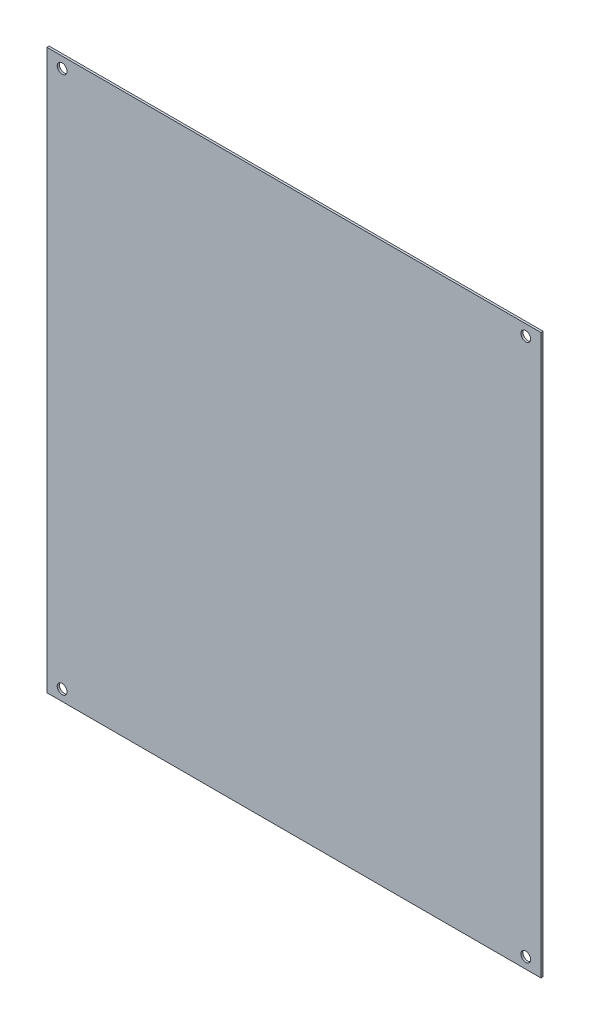
ISO-10303-21;
HEADER;
FILE_DESCRIPTION(('STEP AP214'),'2;1');
FILE_NAME('part.step','',(''),(''),'','','');
FILE_SCHEMA(('AUTOMOTIVE_DESIGN { 1 0 10303 214 1 1 1 1 }'));
ENDSEC;
DATA;
#1=APPLICATION_CONTEXT('core data for automotive mechanical design processes');
#2=APPLICATION_PROTOCOL_DEFINITION('international standard','automotive_design',2000,#1);
#3=PRODUCT_CONTEXT('',#1,'mechanical');
#4=PRODUCT('Part','Part','',(#3));
#5=PRODUCT_RELATED_PRODUCT_CATEGORY('part','',(#4));
#6=PRODUCT_DEFINITION_FORMATION('','',#4);
#7=PRODUCT_DEFINITION_CONTEXT('part definition',#1,'design');
#8=PRODUCT_DEFINITION('design','',#6,#7);
#9=PRODUCT_DEFINITION_SHAPE('','',#8);
#10=(LENGTH_UNIT() NAMED_UNIT(*) SI_UNIT(.MILLI.,.METRE.));
#11=(NAMED_UNIT(*) PLANE_ANGLE_UNIT() SI_UNIT($,.RADIAN.));
#12=(NAMED_UNIT(*) SI_UNIT($,.STERADIAN.) SOLID_ANGLE_UNIT());
#13=UNCERTAINTY_MEASURE_WITH_UNIT(LENGTH_MEASURE(1.E-05),#10,'distance_accuracy_value','');
#14=(GEOMETRIC_REPRESENTATION_CONTEXT(3) GLOBAL_UNCERTAINTY_ASSIGNED_CONTEXT((#13)) GLOBAL_UNIT_ASSIGNED_CONTEXT((#10,
#11,#12)) REPRESENTATION_CONTEXT('',''));
#15=CARTESIAN_POINT('',(0.,0.,0.));
#16=DIRECTION('',(0.,0.,1.));
#17=DIRECTION('',(1.,0.,0.));
#18=AXIS2_PLACEMENT_3D('',#15,#16,#17);
#19=CARTESIAN_POINT('',(-114.,129.,1.));
#20=DIRECTION('',(0.,0.,-1.));
#21=DIRECTION('',(-1.,0.,0.));
#22=AXIS2_PLACEMENT_3D('',#19,#20,#21);
#23=PLANE('',#22);
#24=CARTESIAN_POINT('',(107.,-124.,1.));
#25=DIRECTION('',(0.,0.,1.));
#26=DIRECTION('',(-1.,0.,0.));
#27=AXIS2_PLACEMENT_3D('',#24,#25,#26);
#28=CIRCLE('',#27,2.25);
#29=CARTESIAN_POINT('',(104.75,-124.,1.));
#30=VERTEX_POINT('',#29);
#31=EDGE_CURVE('E119',#30,#30,#28,.T.);
#32=ORIENTED_EDGE('',*,*,#31,.F.);
#33=EDGE_LOOP('',(#32));
#34=FACE_BOUND('',#33,.T.);
#35=CARTESIAN_POINT('',(-107.,124.,1.));
#36=DIRECTION('',(0.,0.,1.));
#37=DIRECTION('',(1.,0.,0.));
#38=AXIS2_PLACEMENT_3D('',#35,#36,#37);
#39=CIRCLE('',#38,2.25);
#40=CARTESIAN_POINT('',(-104.75,124.,1.));
#41=VERTEX_POINT('',#40);
#42=EDGE_CURVE('E98',#41,#41,#39,.T.);
#43=ORIENTED_EDGE('',*,*,#42,.F.);
#44=EDGE_LOOP('',(#43));
#45=FACE_BOUND('',#44,.T.);
#46=DIRECTION('',(0.,-1.,0.));
#47=VECTOR('',#46,1.);
#48=CARTESIAN_POINT('',(-114.,-129.,1.));
#49=LINE('',#48,#47);
#50=CARTESIAN_POINT('',(-114.,129.,1.));
#51=VERTEX_POINT('',#50);
#52=CARTESIAN_POINT('',(-114.,-129.,1.));
#53=VERTEX_POINT('',#52);
#54=EDGE_CURVE('E83',#51,#53,#49,.T.);
#55=ORIENTED_EDGE('',*,*,#54,.T.);
#56=DIRECTION('',(1.,0.,0.));
#57=VECTOR('',#56,1.);
#58=CARTESIAN_POINT('',(-114.,-129.,1.));
#59=LINE('',#58,#57);
#60=CARTESIAN_POINT('',(114.,-129.,1.));
#61=VERTEX_POINT('',#60);
#62=EDGE_CURVE('E78',#53,#61,#59,.T.);
#63=ORIENTED_EDGE('',*,*,#62,.T.);
#64=DIRECTION('',(0.,1.,0.));
#65=VECTOR('',#64,1.);
#66=CARTESIAN_POINT('',(114.,-129.,1.));
#67=LINE('',#66,#65);
#68=CARTESIAN_POINT('',(114.,129.,1.));
#69=VERTEX_POINT('',#68);
#70=EDGE_CURVE('E81',#61,#69,#67,.T.);
#71=ORIENTED_EDGE('',*,*,#70,.T.);
#72=DIRECTION('',(-1.,0.,0.));
#73=VECTOR('',#72,1.);
#74=CARTESIAN_POINT('',(-114.,129.,1.));
#75=LINE('',#74,#73);
#76=EDGE_CURVE('E48',#69,#51,#75,.T.);
#77=ORIENTED_EDGE('',*,*,#76,.T.);
#78=EDGE_LOOP('',(#55,#63,#71,#77));
#79=FACE_BOUND('',#78,.T.);
#80=CARTESIAN_POINT('',(107.,124.,1.));
#81=DIRECTION('',(0.,0.,1.));
#82=DIRECTION('',(1.,0.,0.));
#83=AXIS2_PLACEMENT_3D('',#80,#81,#82);
#84=CIRCLE('',#83,2.25);
#85=CARTESIAN_POINT('',(109.25,124.,1.));
#86=VERTEX_POINT('',#85);
#87=EDGE_CURVE('E113',#86,#86,#84,.T.);
#88=ORIENTED_EDGE('',*,*,#87,.F.);
#89=EDGE_LOOP('',(#88));
#90=FACE_BOUND('',#89,.T.);
#91=CARTESIAN_POINT('',(-107.,-124.,1.));
#92=DIRECTION('',(0.,0.,1.));
#93=DIRECTION('',(-1.,0.,0.));
#94=AXIS2_PLACEMENT_3D('',#91,#92,#93);
#95=CIRCLE('',#94,2.25);
#96=CARTESIAN_POINT('',(-109.25,-124.,1.));
#97=VERTEX_POINT('',#96);
#98=EDGE_CURVE('E125',#97,#97,#95,.T.);
#99=ORIENTED_EDGE('',*,*,#98,.F.);
#100=EDGE_LOOP('',(#99));
#101=FACE_BOUND('',#100,.T.);
#102=ADVANCED_FACE('F31',(#34,#45,#79,#90,#101),#23,.F.);
#103=CARTESIAN_POINT('',(-114.,129.,0.));
#104=DIRECTION('',(0.,0.,-1.));
#105=DIRECTION('',(-1.,0.,0.));
#106=AXIS2_PLACEMENT_3D('',#103,#104,#105);
#107=PLANE('',#106);
#108=CARTESIAN_POINT('',(107.,-124.,0.));
#109=DIRECTION('',(0.,0.,1.));
#110=DIRECTION('',(-1.,0.,0.));
#111=AXIS2_PLACEMENT_3D('',#108,#109,#110);
#112=CIRCLE('',#111,2.25);
#113=CARTESIAN_POINT('',(104.75,-124.,0.));
#114=VERTEX_POINT('',#113);
#115=EDGE_CURVE('E122',#114,#114,#112,.T.);
#116=ORIENTED_EDGE('',*,*,#115,.T.);
#117=EDGE_LOOP('',(#116));
#118=FACE_BOUND('',#117,.T.);
#119=CARTESIAN_POINT('',(-107.,124.,0.));
#120=DIRECTION('',(0.,0.,1.));
#121=DIRECTION('',(1.,0.,0.));
#122=AXIS2_PLACEMENT_3D('',#119,#120,#121);
#123=CIRCLE('',#122,2.25);
#124=CARTESIAN_POINT('',(-104.75,124.,0.));
#125=VERTEX_POINT('',#124);
#126=EDGE_CURVE('E110',#125,#125,#123,.T.);
#127=ORIENTED_EDGE('',*,*,#126,.T.);
#128=EDGE_LOOP('',(#127));
#129=FACE_BOUND('',#128,.T.);
#130=DIRECTION('',(0.,-1.,0.));
#131=VECTOR('',#130,1.);
#132=CARTESIAN_POINT('',(-114.,-129.,0.));
#133=LINE('',#132,#131);
#134=CARTESIAN_POINT('',(-114.,129.,0.));
#135=VERTEX_POINT('',#134);
#136=CARTESIAN_POINT('',(-114.,-129.,0.));
#137=VERTEX_POINT('',#136);
#138=EDGE_CURVE('E95',#135,#137,#133,.T.);
#139=ORIENTED_EDGE('',*,*,#138,.F.);
#140=DIRECTION('',(-1.,0.,0.));
#141=VECTOR('',#140,1.);
#142=CARTESIAN_POINT('',(-114.,129.,0.));
#143=LINE('',#142,#141);
#144=CARTESIAN_POINT('',(114.,129.,0.));
#145=VERTEX_POINT('',#144);
#146=EDGE_CURVE('E71',#145,#135,#143,.T.);
#147=ORIENTED_EDGE('',*,*,#146,.F.);
#148=DIRECTION('',(0.,1.,0.));
#149=VECTOR('',#148,1.);
#150=CARTESIAN_POINT('',(114.,-129.,0.));
#151=LINE('',#150,#149);
#152=CARTESIAN_POINT('',(114.,-129.,0.));
#153=VERTEX_POINT('',#152);
#154=EDGE_CURVE('E65',#153,#145,#151,.T.);
#155=ORIENTED_EDGE('',*,*,#154,.F.);
#156=DIRECTION('',(1.,0.,0.));
#157=VECTOR('',#156,1.);
#158=CARTESIAN_POINT('',(-114.,-129.,0.));
#159=LINE('',#158,#157);
#160=EDGE_CURVE('E87',#137,#153,#159,.T.);
#161=ORIENTED_EDGE('',*,*,#160,.F.);
#162=EDGE_LOOP('',(#139,#147,#155,#161));
#163=FACE_BOUND('',#162,.T.);
#164=CARTESIAN_POINT('',(107.,124.,0.));
#165=DIRECTION('',(0.,0.,1.));
#166=DIRECTION('',(1.,0.,0.));
#167=AXIS2_PLACEMENT_3D('',#164,#165,#166);
#168=CIRCLE('',#167,2.25);
#169=CARTESIAN_POINT('',(109.25,124.,0.));
#170=VERTEX_POINT('',#169);
#171=EDGE_CURVE('E116',#170,#170,#168,.T.);
#172=ORIENTED_EDGE('',*,*,#171,.T.);
#173=EDGE_LOOP('',(#172));
#174=FACE_BOUND('',#173,.T.);
#175=CARTESIAN_POINT('',(-107.,-124.,0.));
#176=DIRECTION('',(0.,0.,1.));
#177=DIRECTION('',(-1.,0.,0.));
#178=AXIS2_PLACEMENT_3D('',#175,#176,#177);
#179=CIRCLE('',#178,2.25);
#180=CARTESIAN_POINT('',(-109.25,-124.,0.));
#181=VERTEX_POINT('',#180);
#182=EDGE_CURVE('E128',#181,#181,#179,.T.);
#183=ORIENTED_EDGE('',*,*,#182,.T.);
#184=EDGE_LOOP('',(#183));
#185=FACE_BOUND('',#184,.T.);
#186=ADVANCED_FACE('F106',(#118,#129,#163,#174,#185),#107,.T.);
#187=CARTESIAN_POINT('',(-114.,-129.,1.));
#188=DIRECTION('',(1.,0.,0.));
#189=DIRECTION('',(0.,1.,0.));
#190=AXIS2_PLACEMENT_3D('',#187,#188,#189);
#191=PLANE('',#190);
#192=ORIENTED_EDGE('',*,*,#138,.T.);
#193=DIRECTION('',(0.,0.,-1.));
#194=VECTOR('',#193,1.);
#195=CARTESIAN_POINT('',(-114.,-129.,1.));
#196=LINE('',#195,#194);
#197=EDGE_CURVE('E11',#53,#137,#196,.T.);
#198=ORIENTED_EDGE('',*,*,#197,.F.);
#199=ORIENTED_EDGE('',*,*,#54,.F.);
#200=DIRECTION('',(0.,0.,-1.));
#201=VECTOR('',#200,1.);
#202=CARTESIAN_POINT('',(-114.,129.,1.));
#203=LINE('',#202,#201);
#204=EDGE_CURVE('E91',#51,#135,#203,.T.);
#205=ORIENTED_EDGE('',*,*,#204,.T.);
#206=EDGE_LOOP('',(#192,#198,#199,#205));
#207=FACE_BOUND('',#206,.T.);
#208=ADVANCED_FACE('F33',(#207),#191,.F.);
#209=CARTESIAN_POINT('',(-114.,-129.,1.));
#210=DIRECTION('',(0.,1.,0.));
#211=DIRECTION('',(0.,0.,1.));
#212=AXIS2_PLACEMENT_3D('',#209,#210,#211);
#213=PLANE('',#212);
#214=ORIENTED_EDGE('',*,*,#160,.T.);
#215=DIRECTION('',(0.,0.,-1.));
#216=VECTOR('',#215,1.);
#217=CARTESIAN_POINT('',(114.,-129.,1.));
#218=LINE('',#217,#216);
#219=EDGE_CURVE('E40',#61,#153,#218,.T.);
#220=ORIENTED_EDGE('',*,*,#219,.F.);
#221=ORIENTED_EDGE('',*,*,#62,.F.);
#222=ORIENTED_EDGE('',*,*,#197,.T.);
#223=EDGE_LOOP('',(#214,#220,#221,#222));
#224=FACE_BOUND('',#223,.T.);
#225=ADVANCED_FACE('F86',(#224),#213,.F.);
#226=CARTESIAN_POINT('',(114.,-129.,1.));
#227=DIRECTION('',(-1.,0.,0.));
#228=DIRECTION('',(0.,0.,1.));
#229=AXIS2_PLACEMENT_3D('',#226,#227,#228);
#230=PLANE('',#229);
#231=ORIENTED_EDGE('',*,*,#154,.T.);
#232=DIRECTION('',(0.,0.,-1.));
#233=VECTOR('',#232,1.);
#234=CARTESIAN_POINT('',(114.,129.,1.));
#235=LINE('',#234,#233);
#236=EDGE_CURVE('E88',#69,#145,#235,.T.);
#237=ORIENTED_EDGE('',*,*,#236,.F.);
#238=ORIENTED_EDGE('',*,*,#70,.F.);
#239=ORIENTED_EDGE('',*,*,#219,.T.);
#240=EDGE_LOOP('',(#231,#237,#238,#239));
#241=FACE_BOUND('',#240,.T.);
#242=ADVANCED_FACE('F89',(#241),#230,.F.);
#243=CARTESIAN_POINT('',(-114.,129.,1.));
#244=DIRECTION('',(0.,-1.,0.));
#245=DIRECTION('',(0.,0.,-1.));
#246=AXIS2_PLACEMENT_3D('',#243,#244,#245);
#247=PLANE('',#246);
#248=ORIENTED_EDGE('',*,*,#146,.T.);
#249=ORIENTED_EDGE('',*,*,#204,.F.);
#250=ORIENTED_EDGE('',*,*,#76,.F.);
#251=ORIENTED_EDGE('',*,*,#236,.T.);
#252=EDGE_LOOP('',(#248,#249,#250,#251));
#253=FACE_BOUND('',#252,.T.);
#254=ADVANCED_FACE('F103',(#253),#247,.F.);
#255=CARTESIAN_POINT('',(-107.,124.,1.));
#256=DIRECTION('',(0.,0.,-1.));
#257=DIRECTION('',(-1.,0.,0.));
#258=AXIS2_PLACEMENT_3D('',#255,#256,#257);
#259=CYLINDRICAL_SURFACE('',#258,2.25);
#260=ORIENTED_EDGE('',*,*,#42,.T.);
#261=EDGE_LOOP('',(#260));
#262=FACE_BOUND('',#261,.T.);
#263=ORIENTED_EDGE('',*,*,#126,.F.);
#264=EDGE_LOOP('',(#263));
#265=FACE_BOUND('',#264,.T.);
#266=ADVANCED_FACE('F148',(#262,#265),#259,.F.);
#267=CARTESIAN_POINT('',(107.,124.,1.));
#268=DIRECTION('',(0.,0.,-1.));
#269=DIRECTION('',(-1.,0.,0.));
#270=AXIS2_PLACEMENT_3D('',#267,#268,#269);
#271=CYLINDRICAL_SURFACE('',#270,2.25);
#272=ORIENTED_EDGE('',*,*,#87,.T.);
#273=EDGE_LOOP('',(#272));
#274=FACE_BOUND('',#273,.T.);
#275=ORIENTED_EDGE('',*,*,#171,.F.);
#276=EDGE_LOOP('',(#275));
#277=FACE_BOUND('',#276,.T.);
#278=ADVANCED_FACE('F194',(#274,#277),#271,.F.);
#279=CARTESIAN_POINT('',(107.,-124.,1.));
#280=DIRECTION('',(0.,0.,-1.));
#281=DIRECTION('',(-1.,0.,0.));
#282=AXIS2_PLACEMENT_3D('',#279,#280,#281);
#283=CYLINDRICAL_SURFACE('',#282,2.25);
#284=ORIENTED_EDGE('',*,*,#31,.T.);
#285=EDGE_LOOP('',(#284));
#286=FACE_BOUND('',#285,.T.);
#287=ORIENTED_EDGE('',*,*,#115,.F.);
#288=EDGE_LOOP('',(#287));
#289=FACE_BOUND('',#288,.T.);
#290=ADVANCED_FACE('F202',(#286,#289),#283,.F.);
#291=CARTESIAN_POINT('',(-107.,-124.,1.));
#292=DIRECTION('',(0.,0.,-1.));
#293=DIRECTION('',(-1.,0.,0.));
#294=AXIS2_PLACEMENT_3D('',#291,#292,#293);
#295=CYLINDRICAL_SURFACE('',#294,2.25);
#296=ORIENTED_EDGE('',*,*,#98,.T.);
#297=EDGE_LOOP('',(#296));
#298=FACE_BOUND('',#297,.T.);
#299=ORIENTED_EDGE('',*,*,#182,.F.);
#300=EDGE_LOOP('',(#299));
#301=FACE_BOUND('',#300,.T.);
#302=ADVANCED_FACE('F134',(#298,#301),#295,.F.);
#303=CLOSED_SHELL('',(#102,#186,#208,#225,#242,#254,#266,#278,#290,#302));
#304=MANIFOLD_SOLID_BREP('B2',#303);
#305=ADVANCED_BREP_SHAPE_REPRESENTATION('',(#18,#304),#14);
#306=SHAPE_DEFINITION_REPRESENTATION(#9,#305);
ENDSEC;
END-ISO-10303-21;
